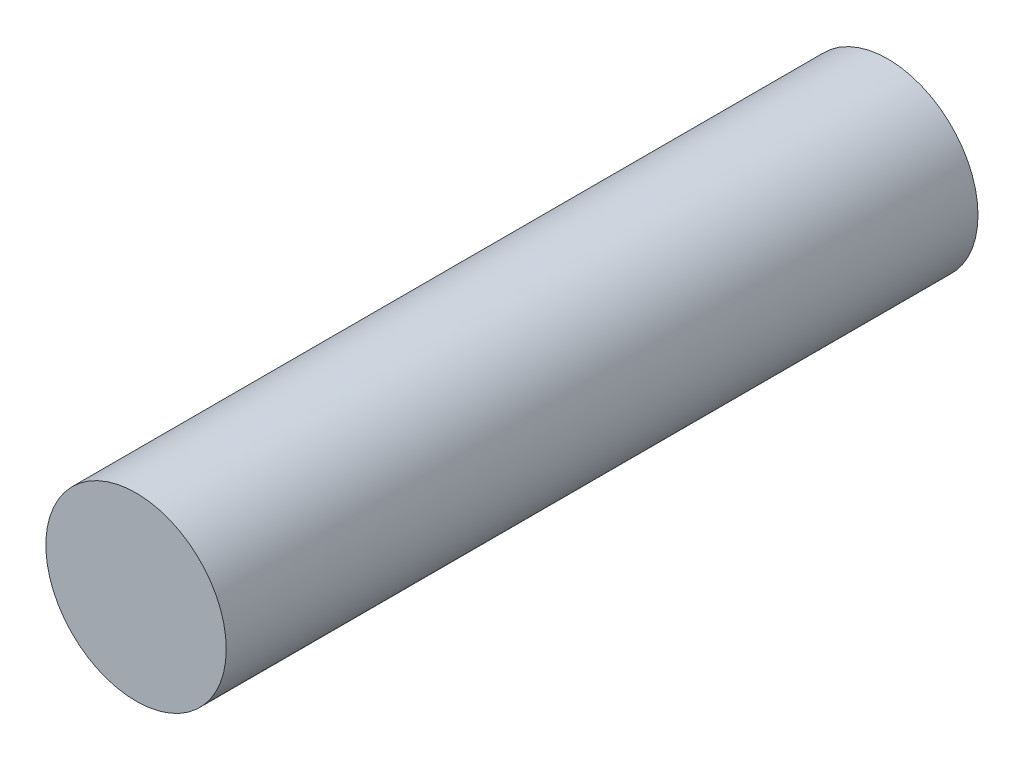
ISO-10303-21;
HEADER;
FILE_DESCRIPTION(('STEP AP214'),'2;1');
FILE_NAME('part.step','',(''),(''),'','','');
FILE_SCHEMA(('AUTOMOTIVE_DESIGN { 1 0 10303 214 1 1 1 1 }'));
ENDSEC;
DATA;
#1=APPLICATION_CONTEXT('core data for automotive mechanical design processes');
#2=APPLICATION_PROTOCOL_DEFINITION('international standard','automotive_design',2000,#1);
#3=PRODUCT_CONTEXT('',#1,'mechanical');
#4=PRODUCT('Part','Part','',(#3));
#5=PRODUCT_RELATED_PRODUCT_CATEGORY('part','',(#4));
#6=PRODUCT_DEFINITION_FORMATION('','',#4);
#7=PRODUCT_DEFINITION_CONTEXT('part definition',#1,'design');
#8=PRODUCT_DEFINITION('design','',#6,#7);
#9=PRODUCT_DEFINITION_SHAPE('','',#8);
#10=(LENGTH_UNIT() NAMED_UNIT(*) SI_UNIT(.MILLI.,.METRE.));
#11=(NAMED_UNIT(*) PLANE_ANGLE_UNIT() SI_UNIT($,.RADIAN.));
#12=(NAMED_UNIT(*) SI_UNIT($,.STERADIAN.) SOLID_ANGLE_UNIT());
#13=UNCERTAINTY_MEASURE_WITH_UNIT(LENGTH_MEASURE(1.E-05),#10,'distance_accuracy_value','');
#14=(GEOMETRIC_REPRESENTATION_CONTEXT(3) GLOBAL_UNCERTAINTY_ASSIGNED_CONTEXT((#13)) GLOBAL_UNIT_ASSIGNED_CONTEXT((#10,
#11,#12)) REPRESENTATION_CONTEXT('',''));
#15=CARTESIAN_POINT('',(0.,0.,0.));
#16=DIRECTION('',(0.,0.,1.));
#17=DIRECTION('',(1.,0.,0.));
#18=AXIS2_PLACEMENT_3D('',#15,#16,#17);
#19=CARTESIAN_POINT('',(0.,0.,50.));
#20=DIRECTION('',(0.,0.,-1.));
#21=DIRECTION('',(-1.,0.,0.));
#22=AXIS2_PLACEMENT_3D('',#19,#20,#21);
#23=CYLINDRICAL_SURFACE('',#22,6.);
#24=CARTESIAN_POINT('',(0.,0.,50.));
#25=DIRECTION('',(0.,0.,1.));
#26=DIRECTION('',(1.,0.,0.));
#27=AXIS2_PLACEMENT_3D('',#24,#25,#26);
#28=CIRCLE('',#27,6.);
#29=CARTESIAN_POINT('',(6.,0.,50.));
#30=VERTEX_POINT('',#29);
#31=EDGE_CURVE('E10',#30,#30,#28,.T.);
#32=ORIENTED_EDGE('',*,*,#31,.F.);
#33=EDGE_LOOP('',(#32));
#34=FACE_BOUND('',#33,.T.);
#35=CARTESIAN_POINT('',(0.,0.,0.));
#36=DIRECTION('',(0.,0.,1.));
#37=DIRECTION('',(1.,0.,0.));
#38=AXIS2_PLACEMENT_3D('',#35,#36,#37);
#39=CIRCLE('',#38,6.);
#40=CARTESIAN_POINT('',(6.,0.,0.));
#41=VERTEX_POINT('',#40);
#42=EDGE_CURVE('E36',#41,#41,#39,.T.);
#43=ORIENTED_EDGE('',*,*,#42,.T.);
#44=EDGE_LOOP('',(#43));
#45=FACE_BOUND('',#44,.T.);
#46=ADVANCED_FACE('F33',(#34,#45),#23,.T.);
#47=CARTESIAN_POINT('',(0.,0.,50.));
#48=DIRECTION('',(0.,0.,1.));
#49=DIRECTION('',(1.,0.,0.));
#50=AXIS2_PLACEMENT_3D('',#47,#48,#49);
#51=PLANE('',#50);
#52=ORIENTED_EDGE('',*,*,#31,.T.);
#53=EDGE_LOOP('',(#52));
#54=FACE_BOUND('',#53,.T.);
#55=ADVANCED_FACE('F48',(#54),#51,.T.);
#56=CARTESIAN_POINT('',(0.,0.,0.));
#57=DIRECTION('',(0.,0.,1.));
#58=DIRECTION('',(1.,0.,0.));
#59=AXIS2_PLACEMENT_3D('',#56,#57,#58);
#60=PLANE('',#59);
#61=ORIENTED_EDGE('',*,*,#42,.F.);
#62=EDGE_LOOP('',(#61));
#63=FACE_BOUND('',#62,.T.);
#64=ADVANCED_FACE('F46',(#63),#60,.F.);
#65=CLOSED_SHELL('',(#46,#55,#64));
#66=MANIFOLD_SOLID_BREP('B2',#65);
#67=ADVANCED_BREP_SHAPE_REPRESENTATION('',(#18,#66),#14);
#68=SHAPE_DEFINITION_REPRESENTATION(#9,#67);
ENDSEC;
END-ISO-10303-21;
